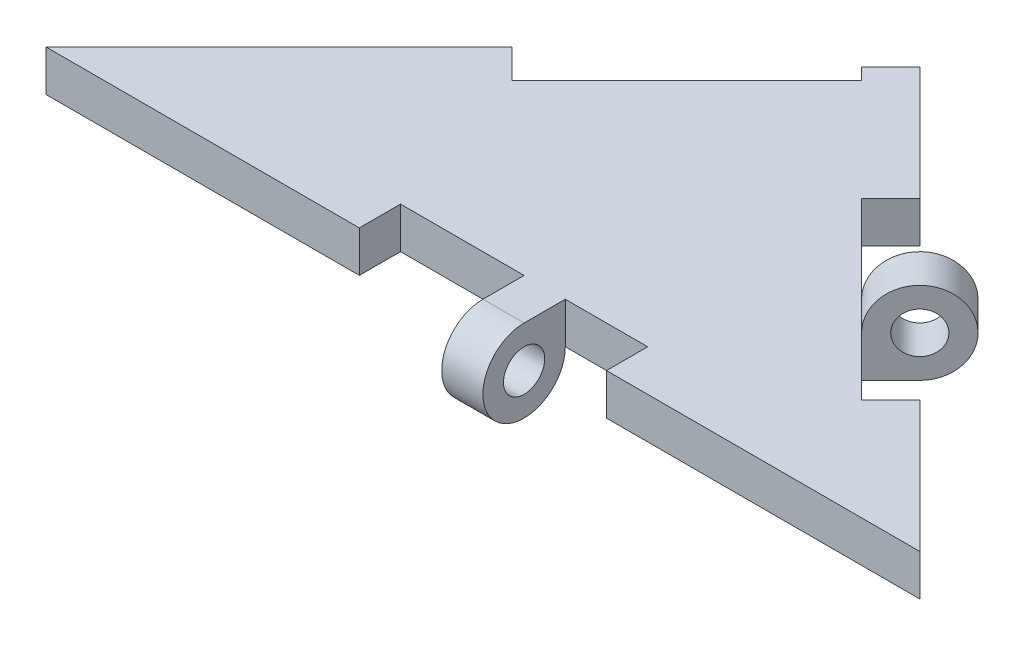
ISO-10303-21;
HEADER;
FILE_DESCRIPTION(('STEP AP214'),'2;1');
FILE_NAME('part.step','',(''),(''),'','','');
FILE_SCHEMA(('AUTOMOTIVE_DESIGN { 1 0 10303 214 1 1 1 1 }'));
ENDSEC;
DATA;
#1=APPLICATION_CONTEXT('core data for automotive mechanical design processes');
#2=APPLICATION_PROTOCOL_DEFINITION('international standard','automotive_design',2000,#1);
#3=PRODUCT_CONTEXT('',#1,'mechanical');
#4=PRODUCT('Part','Part','',(#3));
#5=PRODUCT_RELATED_PRODUCT_CATEGORY('part','',(#4));
#6=PRODUCT_DEFINITION_FORMATION('','',#4);
#7=PRODUCT_DEFINITION_CONTEXT('part definition',#1,'design');
#8=PRODUCT_DEFINITION('design','',#6,#7);
#9=PRODUCT_DEFINITION_SHAPE('','',#8);
#10=(LENGTH_UNIT() NAMED_UNIT(*) SI_UNIT(.MILLI.,.METRE.));
#11=(NAMED_UNIT(*) PLANE_ANGLE_UNIT() SI_UNIT($,.RADIAN.));
#12=(NAMED_UNIT(*) SI_UNIT($,.STERADIAN.) SOLID_ANGLE_UNIT());
#13=UNCERTAINTY_MEASURE_WITH_UNIT(LENGTH_MEASURE(1.E-05),#10,'distance_accuracy_value','');
#14=(GEOMETRIC_REPRESENTATION_CONTEXT(3) GLOBAL_UNCERTAINTY_ASSIGNED_CONTEXT((#13)) GLOBAL_UNIT_ASSIGNED_CONTEXT((#10,
#11,#12)) REPRESENTATION_CONTEXT('',''));
#15=CARTESIAN_POINT('',(0.,0.,0.));
#16=DIRECTION('',(0.,0.,1.));
#17=DIRECTION('',(1.,0.,0.));
#18=AXIS2_PLACEMENT_3D('',#15,#16,#17);
#19=CARTESIAN_POINT('',(12.3743686707646,5.,-33.587572106361));
#20=DIRECTION('',(-0.707106781186548,0.,0.707106781186548));
#21=DIRECTION('',(0.707106781186548,0.,0.707106781186548));
#22=AXIS2_PLACEMENT_3D('',#19,#20,#21);
#23=PLANE('',#22);
#24=DIRECTION('',(0.,1.,0.));
#25=VECTOR('',#24,1.);
#26=CARTESIAN_POINT('',(26.5165042944955,0.,-19.4454364826301));
#27=LINE('',#26,#25);
#28=CARTESIAN_POINT('',(26.5165042944955,0.,-19.4454364826301));
#29=VERTEX_POINT('',#28);
#30=CARTESIAN_POINT('',(26.5165042944955,5.,-19.4454364826301));
#31=VERTEX_POINT('',#30);
#32=EDGE_CURVE('E333',#29,#31,#27,.T.);
#33=ORIENTED_EDGE('',*,*,#32,.T.);
#34=DIRECTION('',(-0.707106781186547,0.,-0.707106781186547));
#35=VECTOR('',#34,1.);
#36=CARTESIAN_POINT('',(12.3743686707646,5.,-33.587572106361));
#37=LINE('',#36,#35);
#38=CARTESIAN_POINT('',(33.587572106361,5.,-12.3743686707646));
#39=VERTEX_POINT('',#38);
#40=EDGE_CURVE('E292',#39,#31,#37,.T.);
#41=ORIENTED_EDGE('',*,*,#40,.F.);
#42=DIRECTION('',(0.,-1.,0.));
#43=VECTOR('',#42,1.);
#44=CARTESIAN_POINT('',(33.587572106361,5.,-12.3743686707646));
#45=LINE('',#44,#43);
#46=CARTESIAN_POINT('',(33.587572106361,0.,-12.3743686707646));
#47=VERTEX_POINT('',#46);
#48=EDGE_CURVE('E287',#39,#47,#45,.T.);
#49=ORIENTED_EDGE('',*,*,#48,.T.);
#50=DIRECTION('',(-0.707106781186547,0.,-0.707106781186547));
#51=VECTOR('',#50,1.);
#52=CARTESIAN_POINT('',(12.3743686707646,0.,-33.587572106361));
#53=LINE('',#52,#51);
#54=EDGE_CURVE('E386',#47,#29,#53,.T.);
#55=ORIENTED_EDGE('',*,*,#54,.T.);
#56=EDGE_LOOP('',(#33,#41,#49,#55));
#57=FACE_BOUND('',#56,.T.);
#58=ADVANCED_FACE('F36',(#57),#23,.F.);
#59=CARTESIAN_POINT('',(-15.,0.,-5.00000000000001));
#60=DIRECTION('',(0.,0.,-1.));
#61=DIRECTION('',(-1.,0.,0.));
#62=AXIS2_PLACEMENT_3D('',#59,#60,#61);
#63=PLANE('',#62);
#64=DIRECTION('',(0.,-1.,0.));
#65=VECTOR('',#64,1.);
#66=CARTESIAN_POINT('',(5.,0.,-5.));
#67=LINE('',#66,#65);
#68=CARTESIAN_POINT('',(5.,5.,-5.));
#69=VERTEX_POINT('',#68);
#70=CARTESIAN_POINT('',(5.,0.,-5.00000000000001));
#71=VERTEX_POINT('',#70);
#72=EDGE_CURVE('E374',#69,#71,#67,.T.);
#73=ORIENTED_EDGE('',*,*,#72,.T.);
#74=DIRECTION('',(-1.,0.,0.));
#75=VECTOR('',#74,1.);
#76=CARTESIAN_POINT('',(-15.,0.,-5.00000000000001));
#77=LINE('',#76,#75);
#78=CARTESIAN_POINT('',(15.,0.,-5.00000000000001));
#79=VERTEX_POINT('',#78);
#80=EDGE_CURVE('E253',#79,#71,#77,.T.);
#81=ORIENTED_EDGE('',*,*,#80,.F.);
#82=DIRECTION('',(0.,1.,0.));
#83=VECTOR('',#82,1.);
#84=CARTESIAN_POINT('',(15.,0.,-5.00000000000001));
#85=LINE('',#84,#83);
#86=CARTESIAN_POINT('',(15.,5.,-5.00000000000001));
#87=VERTEX_POINT('',#86);
#88=EDGE_CURVE('E264',#79,#87,#85,.T.);
#89=ORIENTED_EDGE('',*,*,#88,.T.);
#90=DIRECTION('',(-1.,0.,0.));
#91=VECTOR('',#90,1.);
#92=CARTESIAN_POINT('',(-15.,5.,-5.00000000000001));
#93=LINE('',#92,#91);
#94=EDGE_CURVE('E244',#87,#69,#93,.T.);
#95=ORIENTED_EDGE('',*,*,#94,.T.);
#96=EDGE_LOOP('',(#73,#81,#89,#95));
#97=FACE_BOUND('',#96,.T.);
#98=ADVANCED_FACE('F416',(#97),#63,.F.);
#99=CARTESIAN_POINT('',(0.,5.,-53.0330085889911));
#100=DIRECTION('',(-0.707106781186548,0.,0.707106781186547));
#101=DIRECTION('',(0.707106781186547,0.,0.707106781186548));
#102=AXIS2_PLACEMENT_3D('',#99,#100,#101);
#103=PLANE('',#102);
#104=DIRECTION('',(-0.707106781186547,0.,-0.707106781186548));
#105=VECTOR('',#104,1.);
#106=CARTESIAN_POINT('',(0.,0.,-53.0330085889911));
#107=LINE('',#106,#105);
#108=CARTESIAN_POINT('',(15.9099025766973,0.,-37.1231060122938));
#109=VERTEX_POINT('',#108);
#110=CARTESIAN_POINT('',(2.12132034355964,0.,-50.9116882454314));
#111=VERTEX_POINT('',#110);
#112=EDGE_CURVE('E192',#109,#111,#107,.T.);
#113=ORIENTED_EDGE('',*,*,#112,.T.);
#114=DIRECTION('',(0.,1.,0.));
#115=VECTOR('',#114,1.);
#116=CARTESIAN_POINT('',(2.12132034355964,-5.,-50.9116882454314));
#117=LINE('',#116,#115);
#118=CARTESIAN_POINT('',(2.12132034355964,5.,-50.9116882454314));
#119=VERTEX_POINT('',#118);
#120=EDGE_CURVE('E179',#111,#119,#117,.T.);
#121=ORIENTED_EDGE('',*,*,#120,.T.);
#122=DIRECTION('',(-0.707106781186547,0.,-0.707106781186548));
#123=VECTOR('',#122,1.);
#124=CARTESIAN_POINT('',(0.,5.,-53.0330085889911));
#125=LINE('',#124,#123);
#126=CARTESIAN_POINT('',(15.9099025766973,5.,-37.1231060122938));
#127=VERTEX_POINT('',#126);
#128=EDGE_CURVE('E190',#127,#119,#125,.T.);
#129=ORIENTED_EDGE('',*,*,#128,.F.);
#130=DIRECTION('',(0.,-1.,0.));
#131=VECTOR('',#130,1.);
#132=CARTESIAN_POINT('',(15.9099025766973,5.,-37.1231060122938));
#133=LINE('',#132,#131);
#134=EDGE_CURVE('E288',#127,#109,#133,.T.);
#135=ORIENTED_EDGE('',*,*,#134,.T.);
#136=EDGE_LOOP('',(#113,#121,#129,#135));
#137=FACE_BOUND('',#136,.T.);
#138=ADVANCED_FACE('F188',(#137),#103,.F.);
#139=CARTESIAN_POINT('',(-53.0330085889911,5.,0.));
#140=DIRECTION('',(0.,0.,-1.));
#141=DIRECTION('',(-1.,0.,0.));
#142=AXIS2_PLACEMENT_3D('',#139,#140,#141);
#143=PLANE('',#142);
#144=DIRECTION('',(1.,0.,0.));
#145=VECTOR('',#144,1.);
#146=CARTESIAN_POINT('',(-53.0330085889911,0.,0.));
#147=LINE('',#146,#145);
#148=CARTESIAN_POINT('',(-53.0330085889911,0.,0.));
#149=VERTEX_POINT('',#148);
#150=CARTESIAN_POINT('',(-15.,0.,0.));
#151=VERTEX_POINT('',#150);
#152=EDGE_CURVE('E212',#149,#151,#147,.T.);
#153=ORIENTED_EDGE('',*,*,#152,.T.);
#154=DIRECTION('',(0.,1.,0.));
#155=VECTOR('',#154,1.);
#156=CARTESIAN_POINT('',(-15.,0.,0.));
#157=LINE('',#156,#155);
#158=CARTESIAN_POINT('',(-15.,5.,0.));
#159=VERTEX_POINT('',#158);
#160=EDGE_CURVE('E256',#151,#159,#157,.T.);
#161=ORIENTED_EDGE('',*,*,#160,.T.);
#162=DIRECTION('',(1.,0.,0.));
#163=VECTOR('',#162,1.);
#164=CARTESIAN_POINT('',(-53.0330085889911,5.,0.));
#165=LINE('',#164,#163);
#166=CARTESIAN_POINT('',(-53.0330085889911,5.,0.));
#167=VERTEX_POINT('',#166);
#168=EDGE_CURVE('E199',#167,#159,#165,.T.);
#169=ORIENTED_EDGE('',*,*,#168,.F.);
#170=DIRECTION('',(0.,-1.,0.));
#171=VECTOR('',#170,1.);
#172=CARTESIAN_POINT('',(-53.0330085889911,5.,0.));
#173=LINE('',#172,#171);
#174=EDGE_CURVE('E44',#167,#149,#173,.T.);
#175=ORIENTED_EDGE('',*,*,#174,.T.);
#176=EDGE_LOOP('',(#153,#161,#169,#175));
#177=FACE_BOUND('',#176,.T.);
#178=ADVANCED_FACE('F224',(#177),#143,.F.);
#179=CARTESIAN_POINT('',(-53.0330085889911,5.,0.));
#180=DIRECTION('',(0.707106781186548,0.,0.707106781186547));
#181=DIRECTION('',(0.707106781186547,0.,-0.707106781186548));
#182=AXIS2_PLACEMENT_3D('',#179,#180,#181);
#183=PLANE('',#182);
#184=DIRECTION('',(-0.707106781186547,0.,0.707106781186548));
#185=VECTOR('',#184,1.);
#186=CARTESIAN_POINT('',(-53.0330085889911,5.,0.));
#187=LINE('',#186,#185);
#188=CARTESIAN_POINT('',(-24.7487373415292,5.,-28.2842712474619));
#189=VERTEX_POINT('',#188);
#190=EDGE_CURVE('E218',#189,#167,#187,.T.);
#191=ORIENTED_EDGE('',*,*,#190,.F.);
#192=DIRECTION('',(0.,1.,0.));
#193=VECTOR('',#192,1.);
#194=CARTESIAN_POINT('',(-24.7487373415292,0.,-28.2842712474619));
#195=LINE('',#194,#193);
#196=CARTESIAN_POINT('',(-24.7487373415292,0.,-28.2842712474619));
#197=VERTEX_POINT('',#196);
#198=EDGE_CURVE('E231',#197,#189,#195,.T.);
#199=ORIENTED_EDGE('',*,*,#198,.F.);
#200=DIRECTION('',(-0.707106781186547,0.,0.707106781186548));
#201=VECTOR('',#200,1.);
#202=CARTESIAN_POINT('',(-53.0330085889911,0.,0.));
#203=LINE('',#202,#201);
#204=EDGE_CURVE('E208',#197,#149,#203,.T.);
#205=ORIENTED_EDGE('',*,*,#204,.T.);
#206=ORIENTED_EDGE('',*,*,#174,.F.);
#207=EDGE_LOOP('',(#191,#199,#205,#206));
#208=FACE_BOUND('',#207,.T.);
#209=ADVANCED_FACE('F38',(#208),#183,.F.);
#210=CARTESIAN_POINT('',(15.,5.,0.));
#211=VERTEX_POINT('',#210);
#212=CARTESIAN_POINT('',(53.0330085889911,5.,0.));
#213=VERTEX_POINT('',#212);
#214=EDGE_CURVE('E204',#211,#213,#165,.T.);
#215=ORIENTED_EDGE('',*,*,#214,.F.);
#216=DIRECTION('',(0.,1.,0.));
#217=VECTOR('',#216,1.);
#218=CARTESIAN_POINT('',(15.,0.,0.));
#219=LINE('',#218,#217);
#220=CARTESIAN_POINT('',(15.,0.,0.));
#221=VERTEX_POINT('',#220);
#222=EDGE_CURVE('E266',#221,#211,#219,.T.);
#223=ORIENTED_EDGE('',*,*,#222,.F.);
#224=CARTESIAN_POINT('',(53.0330085889911,0.,0.));
#225=VERTEX_POINT('',#224);
#226=EDGE_CURVE('E210',#221,#225,#147,.T.);
#227=ORIENTED_EDGE('',*,*,#226,.T.);
#228=DIRECTION('',(0.,-1.,0.));
#229=VECTOR('',#228,1.);
#230=CARTESIAN_POINT('',(53.0330085889911,5.,0.));
#231=LINE('',#230,#229);
#232=EDGE_CURVE('E202',#213,#225,#231,.T.);
#233=ORIENTED_EDGE('',*,*,#232,.F.);
#234=EDGE_LOOP('',(#215,#223,#227,#233));
#235=FACE_BOUND('',#234,.T.);
#236=ADVANCED_FACE('F277',(#235),#143,.F.);
#237=CARTESIAN_POINT('',(37.1231060122937,0.,-15.9099025766973));
#238=VERTEX_POINT('',#237);
#239=EDGE_CURVE('E215',#225,#238,#107,.T.);
#240=ORIENTED_EDGE('',*,*,#239,.T.);
#241=DIRECTION('',(0.,-1.,0.));
#242=VECTOR('',#241,1.);
#243=CARTESIAN_POINT('',(37.1231060122937,5.,-15.9099025766973));
#244=LINE('',#243,#242);
#245=CARTESIAN_POINT('',(37.1231060122937,5.,-15.9099025766973));
#246=VERTEX_POINT('',#245);
#247=EDGE_CURVE('E283',#246,#238,#244,.T.);
#248=ORIENTED_EDGE('',*,*,#247,.F.);
#249=EDGE_CURVE('E198',#213,#246,#125,.T.);
#250=ORIENTED_EDGE('',*,*,#249,.F.);
#251=ORIENTED_EDGE('',*,*,#232,.T.);
#252=EDGE_LOOP('',(#240,#248,#250,#251));
#253=FACE_BOUND('',#252,.T.);
#254=ADVANCED_FACE('F282',(#253),#103,.F.);
#255=CARTESIAN_POINT('',(0.,5.,0.));
#256=DIRECTION('',(0.,-1.,0.));
#257=DIRECTION('',(0.,0.,-1.));
#258=AXIS2_PLACEMENT_3D('',#255,#256,#257);
#259=PLANE('',#258);
#260=ORIENTED_EDGE('',*,*,#128,.T.);
#261=DIRECTION('',(0.707106781186548,0.,-0.707106781186548));
#262=VECTOR('',#261,1.);
#263=CARTESIAN_POINT('',(-17.9946055822379,5.,-30.7957623196339));
#264=LINE('',#263,#262);
#265=CARTESIAN_POINT('',(-1.4142135623731,5.,-47.3761543394987));
#266=VERTEX_POINT('',#265);
#267=EDGE_CURVE('E176',#266,#119,#264,.T.);
#268=ORIENTED_EDGE('',*,*,#267,.F.);
#269=DIRECTION('',(-0.707106781186548,0.,-0.707106781186547));
#270=VECTOR('',#269,1.);
#271=CARTESIAN_POINT('',(-3.53553390593274,5.,-49.4974746830583));
#272=LINE('',#271,#270);
#273=CARTESIAN_POINT('',(0.,5.,-45.9619407771256));
#274=VERTEX_POINT('',#273);
#275=EDGE_CURVE('E305',#274,#266,#272,.T.);
#276=ORIENTED_EDGE('',*,*,#275,.F.);
#277=DIRECTION('',(0.707106781186547,0.,-0.707106781186547));
#278=VECTOR('',#277,1.);
#279=CARTESIAN_POINT('',(0.,5.,-45.9619407771256));
#280=LINE('',#279,#278);
#281=CARTESIAN_POINT('',(-21.2132034355964,5.,-24.7487373415292));
#282=VERTEX_POINT('',#281);
#283=EDGE_CURVE('E300',#282,#274,#280,.T.);
#284=ORIENTED_EDGE('',*,*,#283,.F.);
#285=DIRECTION('',(0.707106781186548,0.,0.707106781186547));
#286=VECTOR('',#285,1.);
#287=CARTESIAN_POINT('',(-24.7487373415292,5.,-28.2842712474619));
#288=LINE('',#287,#286);
#289=EDGE_CURVE('E307',#189,#282,#288,.T.);
#290=ORIENTED_EDGE('',*,*,#289,.F.);
#291=ORIENTED_EDGE('',*,*,#190,.T.);
#292=ORIENTED_EDGE('',*,*,#168,.T.);
#293=DIRECTION('',(0.,0.,1.));
#294=VECTOR('',#293,1.);
#295=CARTESIAN_POINT('',(-15.,5.,0.));
#296=LINE('',#295,#294);
#297=CARTESIAN_POINT('',(-15.,5.,-5.00000000000001));
#298=VERTEX_POINT('',#297);
#299=EDGE_CURVE('E257',#298,#159,#296,.T.);
#300=ORIENTED_EDGE('',*,*,#299,.F.);
#301=CARTESIAN_POINT('',(0.,5.,-5.00000000000001));
#302=VERTEX_POINT('',#301);
#303=EDGE_CURVE('E248',#302,#298,#93,.T.);
#304=ORIENTED_EDGE('',*,*,#303,.F.);
#305=DIRECTION('',(0.,0.,-1.));
#306=VECTOR('',#305,1.);
#307=CARTESIAN_POINT('',(0.,5.,0.));
#308=LINE('',#307,#306);
#309=CARTESIAN_POINT('',(0.,5.,0.));
#310=VERTEX_POINT('',#309);
#311=EDGE_CURVE('E358',#310,#302,#308,.T.);
#312=ORIENTED_EDGE('',*,*,#311,.F.);
#313=DIRECTION('',(1.,0.,0.));
#314=VECTOR('',#313,1.);
#315=CARTESIAN_POINT('',(0.,5.,0.));
#316=LINE('',#315,#314);
#317=CARTESIAN_POINT('',(5.,5.,0.));
#318=VERTEX_POINT('',#317);
#319=EDGE_CURVE('E380',#310,#318,#316,.T.);
#320=ORIENTED_EDGE('',*,*,#319,.T.);
#321=DIRECTION('',(0.,0.,-1.));
#322=VECTOR('',#321,1.);
#323=CARTESIAN_POINT('',(5.,5.,0.));
#324=LINE('',#323,#322);
#325=EDGE_CURVE('E371',#318,#69,#324,.T.);
#326=ORIENTED_EDGE('',*,*,#325,.T.);
#327=ORIENTED_EDGE('',*,*,#94,.F.);
#328=DIRECTION('',(0.,0.,-1.));
#329=VECTOR('',#328,1.);
#330=CARTESIAN_POINT('',(15.,5.,0.));
#331=LINE('',#330,#329);
#332=EDGE_CURVE('E259',#211,#87,#331,.T.);
#333=ORIENTED_EDGE('',*,*,#332,.F.);
#334=ORIENTED_EDGE('',*,*,#214,.T.);
#335=ORIENTED_EDGE('',*,*,#249,.T.);
#336=DIRECTION('',(-0.707106781186548,0.,0.707106781186547));
#337=VECTOR('',#336,1.);
#338=CARTESIAN_POINT('',(37.1231060122937,5.,-15.9099025766973));
#339=LINE('',#338,#337);
#340=EDGE_CURVE('E385',#246,#39,#339,.T.);
#341=ORIENTED_EDGE('',*,*,#340,.T.);
#342=ORIENTED_EDGE('',*,*,#40,.T.);
#343=DIRECTION('',(0.707106781186547,0.,0.707106781186548));
#344=VECTOR('',#343,1.);
#345=CARTESIAN_POINT('',(22.9809703885628,5.,-22.9809703885628));
#346=LINE('',#345,#344);
#347=CARTESIAN_POINT('',(22.9809703885628,5.,-22.9809703885628));
#348=VERTEX_POINT('',#347);
#349=EDGE_CURVE('E341',#348,#31,#346,.T.);
#350=ORIENTED_EDGE('',*,*,#349,.F.);
#351=CARTESIAN_POINT('',(12.3743686707646,5.,-33.587572106361));
#352=VERTEX_POINT('',#351);
#353=EDGE_CURVE('E58',#348,#352,#37,.T.);
#354=ORIENTED_EDGE('',*,*,#353,.T.);
#355=DIRECTION('',(0.707106781186549,0.,-0.707106781186546));
#356=VECTOR('',#355,1.);
#357=CARTESIAN_POINT('',(15.9099025766973,5.,-37.1231060122938));
#358=LINE('',#357,#356);
#359=EDGE_CURVE('E197',#352,#127,#358,.T.);
#360=ORIENTED_EDGE('',*,*,#359,.T.);
#361=EDGE_LOOP('',(#260,#268,#276,#284,#290,#291,#292,#300,#304,#312,#320,#326,#327,#333,#334,
#335,#341,#342,#350,#354,#360));
#362=FACE_BOUND('',#361,.T.);
#363=ADVANCED_FACE('F195',(#362),#259,.F.);
#364=CARTESIAN_POINT('',(0.,0.,0.));
#365=DIRECTION('',(0.,-1.,0.));
#366=DIRECTION('',(0.,0.,-1.));
#367=AXIS2_PLACEMENT_3D('',#364,#365,#366);
#368=PLANE('',#367);
#369=DIRECTION('',(-0.707106781186548,0.,0.707106781186548));
#370=VECTOR('',#369,1.);
#371=CARTESIAN_POINT('',(-24.3951839509359,0.,-24.3951839509359));
#372=LINE('',#371,#370);
#373=CARTESIAN_POINT('',(-1.4142135623731,0.,-47.3761543394987));
#374=VERTEX_POINT('',#373);
#375=EDGE_CURVE('E51',#111,#374,#372,.T.);
#376=ORIENTED_EDGE('',*,*,#375,.F.);
#377=ORIENTED_EDGE('',*,*,#112,.F.);
#378=DIRECTION('',(0.707106781186549,0.,-0.707106781186546));
#379=VECTOR('',#378,1.);
#380=CARTESIAN_POINT('',(15.9099025766973,0.,-37.1231060122938));
#381=LINE('',#380,#379);
#382=CARTESIAN_POINT('',(12.3743686707646,0.,-33.587572106361));
#383=VERTEX_POINT('',#382);
#384=EDGE_CURVE('E383',#383,#109,#381,.T.);
#385=ORIENTED_EDGE('',*,*,#384,.F.);
#386=CARTESIAN_POINT('',(22.9809703885628,0.,-22.9809703885628));
#387=VERTEX_POINT('',#386);
#388=EDGE_CURVE('E393',#387,#383,#53,.T.);
#389=ORIENTED_EDGE('',*,*,#388,.F.);
#390=DIRECTION('',(-0.707106781186548,0.,0.707106781186547));
#391=VECTOR('',#390,1.);
#392=CARTESIAN_POINT('',(0.,0.,0.));
#393=LINE('',#392,#391);
#394=CARTESIAN_POINT('',(26.5165042944955,0.,-26.5165042944956));
#395=VERTEX_POINT('',#394);
#396=EDGE_CURVE('E336',#395,#387,#393,.T.);
#397=ORIENTED_EDGE('',*,*,#396,.F.);
#398=DIRECTION('',(0.707106781186547,0.,0.707106781186548));
#399=VECTOR('',#398,1.);
#400=CARTESIAN_POINT('',(26.5165042944955,0.,-26.5165042944956));
#401=LINE('',#400,#399);
#402=CARTESIAN_POINT('',(30.0520382004283,0.,-22.9809703885628));
#403=VERTEX_POINT('',#402);
#404=EDGE_CURVE('E351',#395,#403,#401,.T.);
#405=ORIENTED_EDGE('',*,*,#404,.T.);
#406=DIRECTION('',(-0.707106781186548,0.,0.707106781186547));
#407=VECTOR('',#406,1.);
#408=CARTESIAN_POINT('',(3.53553390593272,0.,3.53553390593273));
#409=LINE('',#408,#407);
#410=EDGE_CURVE('E345',#403,#29,#409,.T.);
#411=ORIENTED_EDGE('',*,*,#410,.T.);
#412=ORIENTED_EDGE('',*,*,#54,.F.);
#413=DIRECTION('',(-0.707106781186548,0.,0.707106781186547));
#414=VECTOR('',#413,1.);
#415=CARTESIAN_POINT('',(37.1231060122937,0.,-15.9099025766973));
#416=LINE('',#415,#414);
#417=EDGE_CURVE('E391',#238,#47,#416,.T.);
#418=ORIENTED_EDGE('',*,*,#417,.F.);
#419=ORIENTED_EDGE('',*,*,#239,.F.);
#420=ORIENTED_EDGE('',*,*,#226,.F.);
#421=DIRECTION('',(0.,0.,-1.));
#422=VECTOR('',#421,1.);
#423=CARTESIAN_POINT('',(15.,0.,0.));
#424=LINE('',#423,#422);
#425=EDGE_CURVE('E243',#221,#79,#424,.T.);
#426=ORIENTED_EDGE('',*,*,#425,.T.);
#427=ORIENTED_EDGE('',*,*,#80,.T.);
#428=DIRECTION('',(1.,0.,0.));
#429=VECTOR('',#428,1.);
#430=CARTESIAN_POINT('',(0.,0.,-5.));
#431=LINE('',#430,#429);
#432=CARTESIAN_POINT('',(0.,0.,-5.00000000000001));
#433=VERTEX_POINT('',#432);
#434=EDGE_CURVE('E368',#433,#71,#431,.T.);
#435=ORIENTED_EDGE('',*,*,#434,.F.);
#436=CARTESIAN_POINT('',(-15.,0.,-5.00000000000001));
#437=VERTEX_POINT('',#436);
#438=EDGE_CURVE('E239',#433,#437,#77,.T.);
#439=ORIENTED_EDGE('',*,*,#438,.T.);
#440=DIRECTION('',(0.,0.,1.));
#441=VECTOR('',#440,1.);
#442=CARTESIAN_POINT('',(-15.,0.,0.));
#443=LINE('',#442,#441);
#444=EDGE_CURVE('E237',#437,#151,#443,.T.);
#445=ORIENTED_EDGE('',*,*,#444,.T.);
#446=ORIENTED_EDGE('',*,*,#152,.F.);
#447=ORIENTED_EDGE('',*,*,#204,.F.);
#448=DIRECTION('',(0.707106781186548,0.,0.707106781186547));
#449=VECTOR('',#448,1.);
#450=CARTESIAN_POINT('',(-24.7487373415292,0.,-28.2842712474619));
#451=LINE('',#450,#449);
#452=CARTESIAN_POINT('',(-21.2132034355964,0.,-24.7487373415292));
#453=VERTEX_POINT('',#452);
#454=EDGE_CURVE('E299',#197,#453,#451,.T.);
#455=ORIENTED_EDGE('',*,*,#454,.T.);
#456=DIRECTION('',(0.707106781186547,0.,-0.707106781186547));
#457=VECTOR('',#456,1.);
#458=CARTESIAN_POINT('',(0.,0.,-45.9619407771256));
#459=LINE('',#458,#457);
#460=CARTESIAN_POINT('',(0.,0.,-45.9619407771256));
#461=VERTEX_POINT('',#460);
#462=EDGE_CURVE('E302',#453,#461,#459,.T.);
#463=ORIENTED_EDGE('',*,*,#462,.T.);
#464=DIRECTION('',(-0.707106781186548,0.,-0.707106781186547));
#465=VECTOR('',#464,1.);
#466=CARTESIAN_POINT('',(-3.53553390593274,0.,-49.4974746830583));
#467=LINE('',#466,#465);
#468=EDGE_CURVE('E296',#461,#374,#467,.T.);
#469=ORIENTED_EDGE('',*,*,#468,.T.);
#470=EDGE_LOOP('',(#376,#377,#385,#389,#397,#405,#411,#412,#418,#419,#420,#426,#427,#435,#439,
#445,#446,#447,#455,#463,#469));
#471=FACE_BOUND('',#470,.T.);
#472=ADVANCED_FACE('F235',(#471),#368,.T.);
#473=CARTESIAN_POINT('',(-15.,0.,0.));
#474=DIRECTION('',(-1.,0.,0.));
#475=DIRECTION('',(0.,0.,1.));
#476=AXIS2_PLACEMENT_3D('',#473,#474,#475);
#477=PLANE('',#476);
#478=ORIENTED_EDGE('',*,*,#299,.T.);
#479=ORIENTED_EDGE('',*,*,#160,.F.);
#480=ORIENTED_EDGE('',*,*,#444,.F.);
#481=DIRECTION('',(0.,1.,0.));
#482=VECTOR('',#481,1.);
#483=CARTESIAN_POINT('',(-15.,0.,-5.00000000000001));
#484=LINE('',#483,#482);
#485=EDGE_CURVE('E211',#437,#298,#484,.T.);
#486=ORIENTED_EDGE('',*,*,#485,.T.);
#487=EDGE_LOOP('',(#478,#479,#480,#486));
#488=FACE_BOUND('',#487,.T.);
#489=ADVANCED_FACE('F433',(#488),#477,.F.);
#490=ORIENTED_EDGE('',*,*,#438,.F.);
#491=DIRECTION('',(0.,-1.,0.));
#492=VECTOR('',#491,1.);
#493=CARTESIAN_POINT('',(0.,0.,-5.));
#494=LINE('',#493,#492);
#495=EDGE_CURVE('E362',#302,#433,#494,.T.);
#496=ORIENTED_EDGE('',*,*,#495,.F.);
#497=ORIENTED_EDGE('',*,*,#303,.T.);
#498=ORIENTED_EDGE('',*,*,#485,.F.);
#499=EDGE_LOOP('',(#490,#496,#497,#498));
#500=FACE_BOUND('',#499,.T.);
#501=ADVANCED_FACE('F431',(#500),#63,.F.);
#502=CARTESIAN_POINT('',(15.,0.,0.));
#503=DIRECTION('',(1.,0.,0.));
#504=DIRECTION('',(0.,0.,-1.));
#505=AXIS2_PLACEMENT_3D('',#502,#503,#504);
#506=PLANE('',#505);
#507=ORIENTED_EDGE('',*,*,#332,.T.);
#508=ORIENTED_EDGE('',*,*,#88,.F.);
#509=ORIENTED_EDGE('',*,*,#425,.F.);
#510=ORIENTED_EDGE('',*,*,#222,.T.);
#511=EDGE_LOOP('',(#507,#508,#509,#510));
#512=FACE_BOUND('',#511,.T.);
#513=ADVANCED_FACE('F414',(#512),#506,.F.);
#514=CARTESIAN_POINT('',(-3.53553390593274,0.,-49.4974746830583));
#515=DIRECTION('',(0.707106781186547,0.,-0.707106781186548));
#516=DIRECTION('',(-0.707106781186548,0.,-0.707106781186547));
#517=AXIS2_PLACEMENT_3D('',#514,#515,#516);
#518=PLANE('',#517);
#519=ORIENTED_EDGE('',*,*,#275,.T.);
#520=DIRECTION('',(0.,-1.,0.));
#521=VECTOR('',#520,1.);
#522=CARTESIAN_POINT('',(-1.4142135623731,0.,-47.3761543394987));
#523=LINE('',#522,#521);
#524=EDGE_CURVE('E11',#266,#374,#523,.T.);
#525=ORIENTED_EDGE('',*,*,#524,.T.);
#526=ORIENTED_EDGE('',*,*,#468,.F.);
#527=DIRECTION('',(0.,1.,0.));
#528=VECTOR('',#527,1.);
#529=CARTESIAN_POINT('',(0.,0.,-45.9619407771256));
#530=LINE('',#529,#528);
#531=EDGE_CURVE('E260',#461,#274,#530,.T.);
#532=ORIENTED_EDGE('',*,*,#531,.T.);
#533=EDGE_LOOP('',(#519,#525,#526,#532));
#534=FACE_BOUND('',#533,.T.);
#535=ADVANCED_FACE('F321',(#534),#518,.F.);
#536=CARTESIAN_POINT('',(0.,0.,-45.9619407771256));
#537=DIRECTION('',(0.707106781186547,0.,0.707106781186548));
#538=DIRECTION('',(0.707106781186548,0.,-0.707106781186547));
#539=AXIS2_PLACEMENT_3D('',#536,#537,#538);
#540=PLANE('',#539);
#541=ORIENTED_EDGE('',*,*,#283,.T.);
#542=ORIENTED_EDGE('',*,*,#531,.F.);
#543=ORIENTED_EDGE('',*,*,#462,.F.);
#544=DIRECTION('',(0.,1.,0.));
#545=VECTOR('',#544,1.);
#546=CARTESIAN_POINT('',(-21.2132034355964,0.,-24.7487373415292));
#547=LINE('',#546,#545);
#548=EDGE_CURVE('E312',#453,#282,#547,.T.);
#549=ORIENTED_EDGE('',*,*,#548,.T.);
#550=EDGE_LOOP('',(#541,#542,#543,#549));
#551=FACE_BOUND('',#550,.T.);
#552=ADVANCED_FACE('F318',(#551),#540,.F.);
#553=CARTESIAN_POINT('',(-24.7487373415292,0.,-28.2842712474619));
#554=DIRECTION('',(-0.707106781186547,0.,0.707106781186548));
#555=DIRECTION('',(0.707106781186548,0.,0.707106781186547));
#556=AXIS2_PLACEMENT_3D('',#553,#554,#555);
#557=PLANE('',#556);
#558=ORIENTED_EDGE('',*,*,#289,.T.);
#559=ORIENTED_EDGE('',*,*,#548,.F.);
#560=ORIENTED_EDGE('',*,*,#454,.F.);
#561=ORIENTED_EDGE('',*,*,#198,.T.);
#562=EDGE_LOOP('',(#558,#559,#560,#561));
#563=FACE_BOUND('',#562,.T.);
#564=ADVANCED_FACE('F316',(#563),#557,.F.);
#565=CARTESIAN_POINT('',(15.9099025766973,5.,-37.1231060122938));
#566=DIRECTION('',(-0.707106781186546,0.,-0.707106781186549));
#567=DIRECTION('',(-0.707106781186549,0.,0.707106781186546));
#568=AXIS2_PLACEMENT_3D('',#565,#566,#567);
#569=PLANE('',#568);
#570=ORIENTED_EDGE('',*,*,#384,.T.);
#571=ORIENTED_EDGE('',*,*,#134,.F.);
#572=ORIENTED_EDGE('',*,*,#359,.F.);
#573=DIRECTION('',(0.,-1.,0.));
#574=VECTOR('',#573,1.);
#575=CARTESIAN_POINT('',(12.3743686707646,5.,-33.587572106361));
#576=LINE('',#575,#574);
#577=EDGE_CURVE('E290',#352,#383,#576,.T.);
#578=ORIENTED_EDGE('',*,*,#577,.T.);
#579=EDGE_LOOP('',(#570,#571,#572,#578));
#580=FACE_BOUND('',#579,.T.);
#581=ADVANCED_FACE('F396',(#580),#569,.F.);
#582=ORIENTED_EDGE('',*,*,#353,.F.);
#583=DIRECTION('',(0.,1.,0.));
#584=VECTOR('',#583,1.);
#585=CARTESIAN_POINT('',(22.9809703885628,0.,-22.9809703885628));
#586=LINE('',#585,#584);
#587=EDGE_CURVE('E339',#387,#348,#586,.T.);
#588=ORIENTED_EDGE('',*,*,#587,.F.);
#589=ORIENTED_EDGE('',*,*,#388,.T.);
#590=ORIENTED_EDGE('',*,*,#577,.F.);
#591=EDGE_LOOP('',(#582,#588,#589,#590));
#592=FACE_BOUND('',#591,.T.);
#593=ADVANCED_FACE('F446',(#592),#23,.F.);
#594=CARTESIAN_POINT('',(37.1231060122937,5.,-15.9099025766973));
#595=DIRECTION('',(0.707106781186547,0.,0.707106781186548));
#596=DIRECTION('',(0.707106781186548,0.,-0.707106781186547));
#597=AXIS2_PLACEMENT_3D('',#594,#595,#596);
#598=PLANE('',#597);
#599=ORIENTED_EDGE('',*,*,#417,.T.);
#600=ORIENTED_EDGE('',*,*,#48,.F.);
#601=ORIENTED_EDGE('',*,*,#340,.F.);
#602=ORIENTED_EDGE('',*,*,#247,.T.);
#603=EDGE_LOOP('',(#599,#600,#601,#602));
#604=FACE_BOUND('',#603,.T.);
#605=ADVANCED_FACE('F411',(#604),#598,.F.);
#606=CARTESIAN_POINT('',(0.,0.,0.));
#607=DIRECTION('',(1.,0.,0.));
#608=DIRECTION('',(0.,0.,-1.));
#609=AXIS2_PLACEMENT_3D('',#606,#607,#608);
#610=CYLINDRICAL_SURFACE('',#609,5.);
#611=CARTESIAN_POINT('',(5.,0.,0.));
#612=DIRECTION('',(-1.,0.,0.));
#613=DIRECTION('',(0.,0.,1.));
#614=AXIS2_PLACEMENT_3D('',#611,#612,#613);
#615=CIRCLE('',#614,5.);
#616=EDGE_CURVE('E354',#71,#318,#615,.T.);
#617=ORIENTED_EDGE('',*,*,#616,.T.);
#618=ORIENTED_EDGE('',*,*,#319,.F.);
#619=CARTESIAN_POINT('',(0.,0.,0.));
#620=DIRECTION('',(-1.,0.,0.));
#621=DIRECTION('',(0.,0.,1.));
#622=AXIS2_PLACEMENT_3D('',#619,#620,#621);
#623=CIRCLE('',#622,5.);
#624=EDGE_CURVE('E355',#433,#310,#623,.T.);
#625=ORIENTED_EDGE('',*,*,#624,.F.);
#626=ORIENTED_EDGE('',*,*,#434,.T.);
#627=EDGE_LOOP('',(#617,#618,#625,#626));
#628=FACE_BOUND('',#627,.T.);
#629=ADVANCED_FACE('F424',(#628),#610,.T.);
#630=CARTESIAN_POINT('',(0.,0.,0.));
#631=DIRECTION('',(1.,0.,0.));
#632=DIRECTION('',(0.,0.,-1.));
#633=AXIS2_PLACEMENT_3D('',#630,#631,#632);
#634=CYLINDRICAL_SURFACE('',#633,2.5);
#635=CARTESIAN_POINT('',(0.,0.,0.));
#636=DIRECTION('',(-1.,0.,0.));
#637=DIRECTION('',(0.,0.,1.));
#638=AXIS2_PLACEMENT_3D('',#635,#636,#637);
#639=CIRCLE('',#638,2.5);
#640=CARTESIAN_POINT('',(0.,0.,2.5));
#641=VERTEX_POINT('',#640);
#642=EDGE_CURVE('E365',#641,#641,#639,.T.);
#643=ORIENTED_EDGE('',*,*,#642,.T.);
#644=EDGE_LOOP('',(#643));
#645=FACE_BOUND('',#644,.T.);
#646=CARTESIAN_POINT('',(5.,0.,0.));
#647=DIRECTION('',(-1.,0.,0.));
#648=DIRECTION('',(0.,0.,1.));
#649=AXIS2_PLACEMENT_3D('',#646,#647,#648);
#650=CIRCLE('',#649,2.5);
#651=CARTESIAN_POINT('',(5.,0.,2.5));
#652=VERTEX_POINT('',#651);
#653=EDGE_CURVE('E359',#652,#652,#650,.T.);
#654=ORIENTED_EDGE('',*,*,#653,.F.);
#655=EDGE_LOOP('',(#654));
#656=FACE_BOUND('',#655,.T.);
#657=ADVANCED_FACE('F531',(#645,#656),#634,.F.);
#658=CARTESIAN_POINT('',(0.,0.,0.));
#659=DIRECTION('',(-1.,0.,0.));
#660=DIRECTION('',(0.,0.,1.));
#661=AXIS2_PLACEMENT_3D('',#658,#659,#660);
#662=PLANE('',#661);
#663=ORIENTED_EDGE('',*,*,#624,.T.);
#664=ORIENTED_EDGE('',*,*,#311,.T.);
#665=ORIENTED_EDGE('',*,*,#495,.T.);
#666=EDGE_LOOP('',(#663,#664,#665));
#667=FACE_BOUND('',#666,.T.);
#668=ORIENTED_EDGE('',*,*,#642,.F.);
#669=EDGE_LOOP('',(#668));
#670=FACE_BOUND('',#669,.T.);
#671=ADVANCED_FACE('F427',(#667,#670),#662,.T.);
#672=CARTESIAN_POINT('',(5.,0.,0.));
#673=DIRECTION('',(-1.,0.,0.));
#674=DIRECTION('',(0.,0.,1.));
#675=AXIS2_PLACEMENT_3D('',#672,#673,#674);
#676=PLANE('',#675);
#677=ORIENTED_EDGE('',*,*,#616,.F.);
#678=ORIENTED_EDGE('',*,*,#72,.F.);
#679=ORIENTED_EDGE('',*,*,#325,.F.);
#680=EDGE_LOOP('',(#677,#678,#679));
#681=FACE_BOUND('',#680,.T.);
#682=ORIENTED_EDGE('',*,*,#653,.T.);
#683=EDGE_LOOP('',(#682));
#684=FACE_BOUND('',#683,.T.);
#685=ADVANCED_FACE('F420',(#681,#684),#676,.F.);
#686=CARTESIAN_POINT('',(26.5165042944955,5.,-26.5165042944955));
#687=DIRECTION('',(0.707106781186547,0.,0.707106781186548));
#688=DIRECTION('',(0.707106781186548,0.,-0.707106781186547));
#689=AXIS2_PLACEMENT_3D('',#686,#687,#688);
#690=CYLINDRICAL_SURFACE('',#689,5.);
#691=CARTESIAN_POINT('',(30.0520382004283,5.,-22.9809703885628));
#692=DIRECTION('',(-0.707106781186547,0.,-0.707106781186548));
#693=DIRECTION('',(-0.707106781186548,0.,0.707106781186547));
#694=AXIS2_PLACEMENT_3D('',#691,#692,#693);
#695=CIRCLE('',#694,5.);
#696=EDGE_CURVE('E326',#31,#403,#695,.T.);
#697=ORIENTED_EDGE('',*,*,#696,.T.);
#698=ORIENTED_EDGE('',*,*,#404,.F.);
#699=CARTESIAN_POINT('',(26.5165042944955,5.,-26.5165042944955));
#700=DIRECTION('',(-0.707106781186547,0.,-0.707106781186548));
#701=DIRECTION('',(-0.707106781186548,0.,0.707106781186547));
#702=AXIS2_PLACEMENT_3D('',#699,#700,#701);
#703=CIRCLE('',#702,5.);
#704=EDGE_CURVE('E332',#348,#395,#703,.T.);
#705=ORIENTED_EDGE('',*,*,#704,.F.);
#706=ORIENTED_EDGE('',*,*,#349,.T.);
#707=EDGE_LOOP('',(#697,#698,#705,#706));
#708=FACE_BOUND('',#707,.T.);
#709=ADVANCED_FACE('F403',(#708),#690,.T.);
#710=CARTESIAN_POINT('',(26.5165042944955,5.,-26.5165042944955));
#711=DIRECTION('',(0.707106781186547,0.,0.707106781186548));
#712=DIRECTION('',(0.707106781186548,0.,-0.707106781186547));
#713=AXIS2_PLACEMENT_3D('',#710,#711,#712);
#714=CYLINDRICAL_SURFACE('',#713,2.5);
#715=CARTESIAN_POINT('',(26.5165042944955,5.,-26.5165042944955));
#716=DIRECTION('',(-0.707106781186547,0.,-0.707106781186548));
#717=DIRECTION('',(-0.707106781186548,0.,0.707106781186547));
#718=AXIS2_PLACEMENT_3D('',#715,#716,#717);
#719=CIRCLE('',#718,2.5);
#720=CARTESIAN_POINT('',(24.7487373415292,5.,-24.7487373415292));
#721=VERTEX_POINT('',#720);
#722=EDGE_CURVE('E329',#721,#721,#719,.T.);
#723=ORIENTED_EDGE('',*,*,#722,.T.);
#724=EDGE_LOOP('',(#723));
#725=FACE_BOUND('',#724,.T.);
#726=CARTESIAN_POINT('',(30.0520382004283,5.,-22.9809703885628));
#727=DIRECTION('',(-0.707106781186547,0.,-0.707106781186548));
#728=DIRECTION('',(-0.707106781186548,0.,0.707106781186547));
#729=AXIS2_PLACEMENT_3D('',#726,#727,#728);
#730=CIRCLE('',#729,2.5);
#731=CARTESIAN_POINT('',(28.2842712474619,5.,-21.2132034355964));
#732=VERTEX_POINT('',#731);
#733=EDGE_CURVE('E323',#732,#732,#730,.T.);
#734=ORIENTED_EDGE('',*,*,#733,.F.);
#735=EDGE_LOOP('',(#734));
#736=FACE_BOUND('',#735,.T.);
#737=ADVANCED_FACE('F576',(#725,#736),#714,.F.);
#738=CARTESIAN_POINT('',(0.,0.,0.));
#739=DIRECTION('',(-0.707106781186547,0.,-0.707106781186548));
#740=DIRECTION('',(-0.707106781186548,0.,0.707106781186547));
#741=AXIS2_PLACEMENT_3D('',#738,#739,#740);
#742=PLANE('',#741);
#743=ORIENTED_EDGE('',*,*,#722,.F.);
#744=EDGE_LOOP('',(#743));
#745=FACE_BOUND('',#744,.T.);
#746=ORIENTED_EDGE('',*,*,#704,.T.);
#747=ORIENTED_EDGE('',*,*,#396,.T.);
#748=ORIENTED_EDGE('',*,*,#587,.T.);
#749=EDGE_LOOP('',(#746,#747,#748));
#750=FACE_BOUND('',#749,.T.);
#751=ADVANCED_FACE('F399',(#745,#750),#742,.T.);
#752=CARTESIAN_POINT('',(3.53553390593272,0.,3.53553390593273));
#753=DIRECTION('',(-0.707106781186547,0.,-0.707106781186548));
#754=DIRECTION('',(-0.707106781186548,0.,0.707106781186547));
#755=AXIS2_PLACEMENT_3D('',#752,#753,#754);
#756=PLANE('',#755);
#757=ORIENTED_EDGE('',*,*,#733,.T.);
#758=EDGE_LOOP('',(#757));
#759=FACE_BOUND('',#758,.T.);
#760=ORIENTED_EDGE('',*,*,#696,.F.);
#761=ORIENTED_EDGE('',*,*,#32,.F.);
#762=ORIENTED_EDGE('',*,*,#410,.F.);
#763=EDGE_LOOP('',(#760,#761,#762));
#764=FACE_BOUND('',#763,.T.);
#765=ADVANCED_FACE('F408',(#759,#764),#756,.F.);
#766=CARTESIAN_POINT('',(-17.9946055822379,-5.,-30.7957623196339));
#767=DIRECTION('',(0.707106781186548,0.,0.707106781186548));
#768=DIRECTION('',(0.707106781186548,0.,-0.707106781186548));
#769=AXIS2_PLACEMENT_3D('',#766,#767,#768);
#770=PLANE('',#769);
#771=ORIENTED_EDGE('',*,*,#375,.T.);
#772=ORIENTED_EDGE('',*,*,#524,.F.);
#773=ORIENTED_EDGE('',*,*,#267,.T.);
#774=ORIENTED_EDGE('',*,*,#120,.F.);
#775=EDGE_LOOP('',(#771,#772,#773,#774));
#776=FACE_BOUND('',#775,.T.);
#777=ADVANCED_FACE('F178',(#776),#770,.F.);
#778=CLOSED_SHELL('',(#58,#98,#138,#178,#209,#236,#254,#363,#472,#489,#501,#513,#535,#552,#564,
#581,#593,#605,#629,#657,#671,#685,#709,#737,#751,#765,#777));
#779=MANIFOLD_SOLID_BREP('B2',#778);
#780=ADVANCED_BREP_SHAPE_REPRESENTATION('',(#18,#779),#14);
#781=SHAPE_DEFINITION_REPRESENTATION(#9,#780);
ENDSEC;
END-ISO-10303-21;
